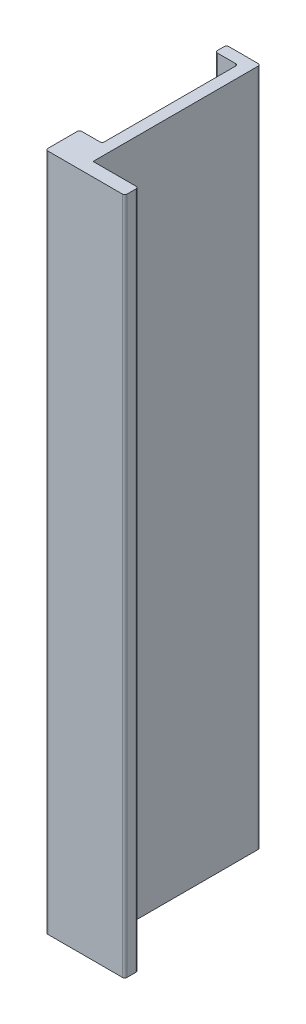
ISO-10303-21;
HEADER;
FILE_DESCRIPTION(('STEP AP214'),'2;1');
FILE_NAME('part.step','',(''),(''),'','','');
FILE_SCHEMA(('AUTOMOTIVE_DESIGN { 1 0 10303 214 1 1 1 1 }'));
ENDSEC;
DATA;
#1=APPLICATION_CONTEXT('core data for automotive mechanical design processes');
#2=APPLICATION_PROTOCOL_DEFINITION('international standard','automotive_design',2000,#1);
#3=PRODUCT_CONTEXT('',#1,'mechanical');
#4=PRODUCT('Part','Part','',(#3));
#5=PRODUCT_RELATED_PRODUCT_CATEGORY('part','',(#4));
#6=PRODUCT_DEFINITION_FORMATION('','',#4);
#7=PRODUCT_DEFINITION_CONTEXT('part definition',#1,'design');
#8=PRODUCT_DEFINITION('design','',#6,#7);
#9=PRODUCT_DEFINITION_SHAPE('','',#8);
#10=(LENGTH_UNIT() NAMED_UNIT(*) SI_UNIT(.MILLI.,.METRE.));
#11=(NAMED_UNIT(*) PLANE_ANGLE_UNIT() SI_UNIT($,.RADIAN.));
#12=(NAMED_UNIT(*) SI_UNIT($,.STERADIAN.) SOLID_ANGLE_UNIT());
#13=UNCERTAINTY_MEASURE_WITH_UNIT(LENGTH_MEASURE(1.E-05),#10,'distance_accuracy_value','');
#14=(GEOMETRIC_REPRESENTATION_CONTEXT(3) GLOBAL_UNCERTAINTY_ASSIGNED_CONTEXT((#13)) GLOBAL_UNIT_ASSIGNED_CONTEXT((#10,
#11,#12)) REPRESENTATION_CONTEXT('',''));
#15=CARTESIAN_POINT('',(0.,0.,0.));
#16=DIRECTION('',(0.,0.,1.));
#17=DIRECTION('',(1.,0.,0.));
#18=AXIS2_PLACEMENT_3D('',#15,#16,#17);
#19=CARTESIAN_POINT('',(0.,0.,0.));
#20=DIRECTION('',(1.,0.,0.));
#21=DIRECTION('',(0.,0.,-1.));
#22=AXIS2_PLACEMENT_3D('',#19,#20,#21);
#23=PLANE('',#22);
#24=DIRECTION('',(0.,0.,1.));
#25=VECTOR('',#24,1.);
#26=CARTESIAN_POINT('',(0.,300.,0.));
#27=LINE('',#26,#25);
#28=CARTESIAN_POINT('',(0.,300.,-14.));
#29=VERTEX_POINT('',#28);
#30=CARTESIAN_POINT('',(0.,300.,-1.));
#31=VERTEX_POINT('',#30);
#32=EDGE_CURVE('E216',#29,#31,#27,.T.);
#33=ORIENTED_EDGE('',*,*,#32,.F.);
#34=DIRECTION('',(0.,1.,0.));
#35=VECTOR('',#34,1.);
#36=CARTESIAN_POINT('',(0.,0.,-14.));
#37=LINE('',#36,#35);
#38=CARTESIAN_POINT('',(0.,0.,-14.));
#39=VERTEX_POINT('',#38);
#40=EDGE_CURVE('E247',#29,#39,#37,.F.);
#41=ORIENTED_EDGE('',*,*,#40,.T.);
#42=DIRECTION('',(0.,0.,-1.));
#43=VECTOR('',#42,1.);
#44=CARTESIAN_POINT('',(0.,0.,0.));
#45=LINE('',#44,#43);
#46=CARTESIAN_POINT('',(0.,0.,-1.));
#47=VERTEX_POINT('',#46);
#48=EDGE_CURVE('E213',#47,#39,#45,.T.);
#49=ORIENTED_EDGE('',*,*,#48,.F.);
#50=DIRECTION('',(0.,-1.,0.));
#51=VECTOR('',#50,1.);
#52=CARTESIAN_POINT('',(0.,0.,-1.));
#53=LINE('',#52,#51);
#54=EDGE_CURVE('E245',#47,#31,#53,.F.);
#55=ORIENTED_EDGE('',*,*,#54,.T.);
#56=EDGE_LOOP('',(#33,#41,#49,#55));
#57=FACE_BOUND('',#56,.T.);
#58=ADVANCED_FACE('F39',(#57),#23,.F.);
#59=CARTESIAN_POINT('',(15.,0.,0.));
#60=DIRECTION('',(0.,1.,0.));
#61=DIRECTION('',(0.,0.,1.));
#62=AXIS2_PLACEMENT_3D('',#59,#60,#61);
#63=PLANE('',#62);
#64=ORIENTED_EDGE('',*,*,#48,.T.);
#65=CARTESIAN_POINT('',(0.999999999999999,0.,-14.));
#66=DIRECTION('',(0.,1.,0.));
#67=DIRECTION('',(0.,0.,1.));
#68=AXIS2_PLACEMENT_3D('',#65,#66,#67);
#69=CIRCLE('',#68,1.);
#70=CARTESIAN_POINT('',(0.999999999999999,0.,-15.));
#71=VERTEX_POINT('',#70);
#72=EDGE_CURVE('E259',#39,#71,#69,.F.);
#73=ORIENTED_EDGE('',*,*,#72,.T.);
#74=DIRECTION('',(-1.,0.,0.));
#75=VECTOR('',#74,1.);
#76=CARTESIAN_POINT('',(10.,0.,-15.));
#77=LINE('',#76,#75);
#78=CARTESIAN_POINT('',(9.,0.,-15.));
#79=VERTEX_POINT('',#78);
#80=EDGE_CURVE('E203',#79,#71,#77,.T.);
#81=ORIENTED_EDGE('',*,*,#80,.F.);
#82=CARTESIAN_POINT('',(9.,0.,-16.));
#83=DIRECTION('',(0.,1.,0.));
#84=DIRECTION('',(0.,0.,1.));
#85=AXIS2_PLACEMENT_3D('',#82,#83,#84);
#86=CIRCLE('',#85,1.);
#87=CARTESIAN_POINT('',(10.,0.,-16.));
#88=VERTEX_POINT('',#87);
#89=EDGE_CURVE('E296',#79,#88,#86,.T.);
#90=ORIENTED_EDGE('',*,*,#89,.T.);
#91=DIRECTION('',(0.,0.,1.));
#92=VECTOR('',#91,1.);
#93=CARTESIAN_POINT('',(10.,0.,-15.));
#94=LINE('',#93,#92);
#95=CARTESIAN_POINT('',(10.,0.,-74.));
#96=VERTEX_POINT('',#95);
#97=EDGE_CURVE('E304',#96,#88,#94,.T.);
#98=ORIENTED_EDGE('',*,*,#97,.F.);
#99=CARTESIAN_POINT('',(9.,0.,-74.));
#100=DIRECTION('',(0.,1.,0.));
#101=DIRECTION('',(0.,0.,1.));
#102=AXIS2_PLACEMENT_3D('',#99,#100,#101);
#103=CIRCLE('',#102,1.);
#104=CARTESIAN_POINT('',(9.,0.,-75.));
#105=VERTEX_POINT('',#104);
#106=EDGE_CURVE('E47',#96,#105,#103,.T.);
#107=ORIENTED_EDGE('',*,*,#106,.T.);
#108=DIRECTION('',(-1.,0.,0.));
#109=VECTOR('',#108,1.);
#110=CARTESIAN_POINT('',(10.,0.,-75.));
#111=LINE('',#110,#109);
#112=CARTESIAN_POINT('',(0.999999999999999,0.,-75.));
#113=VERTEX_POINT('',#112);
#114=EDGE_CURVE('E302',#105,#113,#111,.T.);
#115=ORIENTED_EDGE('',*,*,#114,.T.);
#116=CARTESIAN_POINT('',(0.999999999999999,0.,-76.));
#117=DIRECTION('',(0.,1.,0.));
#118=DIRECTION('',(0.,0.,1.));
#119=AXIS2_PLACEMENT_3D('',#116,#117,#118);
#120=CIRCLE('',#119,1.);
#121=CARTESIAN_POINT('',(0.,0.,-76.));
#122=VERTEX_POINT('',#121);
#123=EDGE_CURVE('E249',#113,#122,#120,.F.);
#124=ORIENTED_EDGE('',*,*,#123,.T.);
#125=CARTESIAN_POINT('',(0.,0.,-79.));
#126=VERTEX_POINT('',#125);
#127=EDGE_CURVE('E208',#122,#126,#45,.T.);
#128=ORIENTED_EDGE('',*,*,#127,.T.);
#129=CARTESIAN_POINT('',(1.,0.,-79.));
#130=DIRECTION('',(0.,1.,0.));
#131=DIRECTION('',(0.,0.,1.));
#132=AXIS2_PLACEMENT_3D('',#129,#130,#131);
#133=CIRCLE('',#132,1.);
#134=CARTESIAN_POINT('',(1.,0.,-80.));
#135=VERTEX_POINT('',#134);
#136=EDGE_CURVE('E251',#126,#135,#133,.F.);
#137=ORIENTED_EDGE('',*,*,#136,.T.);
#138=DIRECTION('',(-1.,0.,0.));
#139=VECTOR('',#138,1.);
#140=CARTESIAN_POINT('',(15.,0.,-80.));
#141=LINE('',#140,#139);
#142=CARTESIAN_POINT('',(14.,0.,-80.));
#143=VERTEX_POINT('',#142);
#144=EDGE_CURVE('E224',#143,#135,#141,.T.);
#145=ORIENTED_EDGE('',*,*,#144,.F.);
#146=CARTESIAN_POINT('',(14.,0.,-79.));
#147=DIRECTION('',(0.,1.,0.));
#148=DIRECTION('',(0.,0.,1.));
#149=AXIS2_PLACEMENT_3D('',#146,#147,#148);
#150=CIRCLE('',#149,1.);
#151=CARTESIAN_POINT('',(15.,0.,-79.));
#152=VERTEX_POINT('',#151);
#153=EDGE_CURVE('E257',#143,#152,#150,.F.);
#154=ORIENTED_EDGE('',*,*,#153,.T.);
#155=DIRECTION('',(0.,0.,-1.));
#156=VECTOR('',#155,1.);
#157=CARTESIAN_POINT('',(15.,0.,0.));
#158=LINE('',#157,#156);
#159=CARTESIAN_POINT('',(15.,0.,-6.));
#160=VERTEX_POINT('',#159);
#161=EDGE_CURVE('E183',#160,#152,#158,.T.);
#162=ORIENTED_EDGE('',*,*,#161,.F.);
#163=DIRECTION('',(-1.,0.,0.));
#164=VECTOR('',#163,1.);
#165=CARTESIAN_POINT('',(35.,0.,-6.));
#166=LINE('',#165,#164);
#167=CARTESIAN_POINT('',(34.,0.,-6.));
#168=VERTEX_POINT('',#167);
#169=EDGE_CURVE('E193',#168,#160,#166,.T.);
#170=ORIENTED_EDGE('',*,*,#169,.F.);
#171=CARTESIAN_POINT('',(34.,0.,-5.));
#172=DIRECTION('',(0.,1.,0.));
#173=DIRECTION('',(0.,0.,1.));
#174=AXIS2_PLACEMENT_3D('',#171,#172,#173);
#175=CIRCLE('',#174,1.);
#176=CARTESIAN_POINT('',(35.,0.,-5.));
#177=VERTEX_POINT('',#176);
#178=EDGE_CURVE('E254',#168,#177,#175,.F.);
#179=ORIENTED_EDGE('',*,*,#178,.T.);
#180=DIRECTION('',(0.,0.,-1.));
#181=VECTOR('',#180,1.);
#182=CARTESIAN_POINT('',(35.,0.,0.));
#183=LINE('',#182,#181);
#184=CARTESIAN_POINT('',(35.,0.,-1.));
#185=VERTEX_POINT('',#184);
#186=EDGE_CURVE('E198',#185,#177,#183,.T.);
#187=ORIENTED_EDGE('',*,*,#186,.F.);
#188=CARTESIAN_POINT('',(34.,0.,-1.));
#189=DIRECTION('',(0.,1.,0.));
#190=DIRECTION('',(0.,0.,1.));
#191=AXIS2_PLACEMENT_3D('',#188,#189,#190);
#192=CIRCLE('',#191,1.);
#193=CARTESIAN_POINT('',(34.,0.,0.));
#194=VERTEX_POINT('',#193);
#195=EDGE_CURVE('E62',#185,#194,#192,.F.);
#196=ORIENTED_EDGE('',*,*,#195,.T.);
#197=DIRECTION('',(-1.,0.,0.));
#198=VECTOR('',#197,1.);
#199=CARTESIAN_POINT('',(15.,0.,0.));
#200=LINE('',#199,#198);
#201=CARTESIAN_POINT('',(1.,0.,0.));
#202=VERTEX_POINT('',#201);
#203=EDGE_CURVE('E182',#194,#202,#200,.T.);
#204=ORIENTED_EDGE('',*,*,#203,.T.);
#205=CARTESIAN_POINT('',(1.,0.,-1.));
#206=DIRECTION('',(0.,1.,0.));
#207=DIRECTION('',(0.,0.,1.));
#208=AXIS2_PLACEMENT_3D('',#205,#206,#207);
#209=CIRCLE('',#208,1.);
#210=EDGE_CURVE('E54',#202,#47,#209,.F.);
#211=ORIENTED_EDGE('',*,*,#210,.T.);
#212=EDGE_LOOP('',(#64,#73,#81,#90,#98,#107,#115,#124,#128,#137,#145,#154,#162,#170,#179,#187,
#196,#204,#211));
#213=FACE_BOUND('',#212,.T.);
#214=ADVANCED_FACE('F301',(#213),#63,.F.);
#215=CARTESIAN_POINT('',(15.,0.,-80.));
#216=DIRECTION('',(0.,0.,1.));
#217=DIRECTION('',(1.,0.,0.));
#218=AXIS2_PLACEMENT_3D('',#215,#216,#217);
#219=PLANE('',#218);
#220=DIRECTION('',(-1.,0.,0.));
#221=VECTOR('',#220,1.);
#222=CARTESIAN_POINT('',(15.,300.,-80.));
#223=LINE('',#222,#221);
#224=CARTESIAN_POINT('',(14.,300.,-80.));
#225=VERTEX_POINT('',#224);
#226=CARTESIAN_POINT('',(1.,300.,-80.));
#227=VERTEX_POINT('',#226);
#228=EDGE_CURVE('E221',#225,#227,#223,.T.);
#229=ORIENTED_EDGE('',*,*,#228,.F.);
#230=DIRECTION('',(0.,1.,0.));
#231=VECTOR('',#230,1.);
#232=CARTESIAN_POINT('',(14.,0.,-80.));
#233=LINE('',#232,#231);
#234=EDGE_CURVE('E265',#225,#143,#233,.F.);
#235=ORIENTED_EDGE('',*,*,#234,.T.);
#236=ORIENTED_EDGE('',*,*,#144,.T.);
#237=DIRECTION('',(0.,1.,0.));
#238=VECTOR('',#237,1.);
#239=CARTESIAN_POINT('',(1.,0.,-80.));
#240=LINE('',#239,#238);
#241=EDGE_CURVE('E262',#135,#227,#240,.T.);
#242=ORIENTED_EDGE('',*,*,#241,.T.);
#243=EDGE_LOOP('',(#229,#235,#236,#242));
#244=FACE_BOUND('',#243,.T.);
#245=ADVANCED_FACE('F344',(#244),#219,.F.);
#246=CARTESIAN_POINT('',(15.,300.,0.));
#247=DIRECTION('',(0.,-1.,0.));
#248=DIRECTION('',(0.,0.,-1.));
#249=AXIS2_PLACEMENT_3D('',#246,#247,#248);
#250=PLANE('',#249);
#251=DIRECTION('',(-1.,0.,0.));
#252=VECTOR('',#251,1.);
#253=CARTESIAN_POINT('',(10.,300.,-15.));
#254=LINE('',#253,#252);
#255=CARTESIAN_POINT('',(9.,300.,-15.));
#256=VERTEX_POINT('',#255);
#257=CARTESIAN_POINT('',(0.999999999999999,300.,-15.));
#258=VERTEX_POINT('',#257);
#259=EDGE_CURVE('E199',#256,#258,#254,.T.);
#260=ORIENTED_EDGE('',*,*,#259,.T.);
#261=CARTESIAN_POINT('',(0.999999999999999,300.,-14.));
#262=DIRECTION('',(0.,-1.,0.));
#263=DIRECTION('',(0.,0.,-1.));
#264=AXIS2_PLACEMENT_3D('',#261,#262,#263);
#265=CIRCLE('',#264,1.);
#266=EDGE_CURVE('E243',#258,#29,#265,.F.);
#267=ORIENTED_EDGE('',*,*,#266,.T.);
#268=ORIENTED_EDGE('',*,*,#32,.T.);
#269=CARTESIAN_POINT('',(1.,300.,-1.));
#270=DIRECTION('',(0.,-1.,0.));
#271=DIRECTION('',(0.,0.,-1.));
#272=AXIS2_PLACEMENT_3D('',#269,#270,#271);
#273=CIRCLE('',#272,1.);
#274=CARTESIAN_POINT('',(1.,300.,0.));
#275=VERTEX_POINT('',#274);
#276=EDGE_CURVE('E236',#31,#275,#273,.F.);
#277=ORIENTED_EDGE('',*,*,#276,.T.);
#278=DIRECTION('',(-1.,0.,0.));
#279=VECTOR('',#278,1.);
#280=CARTESIAN_POINT('',(15.,300.,0.));
#281=LINE('',#280,#279);
#282=CARTESIAN_POINT('',(34.,300.,0.));
#283=VERTEX_POINT('',#282);
#284=EDGE_CURVE('E218',#283,#275,#281,.T.);
#285=ORIENTED_EDGE('',*,*,#284,.F.);
#286=CARTESIAN_POINT('',(34.,300.,-1.));
#287=DIRECTION('',(0.,-1.,0.));
#288=DIRECTION('',(0.,0.,-1.));
#289=AXIS2_PLACEMENT_3D('',#286,#287,#288);
#290=CIRCLE('',#289,1.);
#291=CARTESIAN_POINT('',(35.,300.,-1.));
#292=VERTEX_POINT('',#291);
#293=EDGE_CURVE('E239',#283,#292,#290,.F.);
#294=ORIENTED_EDGE('',*,*,#293,.T.);
#295=DIRECTION('',(0.,0.,1.));
#296=VECTOR('',#295,1.);
#297=CARTESIAN_POINT('',(35.,300.,0.));
#298=LINE('',#297,#296);
#299=CARTESIAN_POINT('',(35.,300.,-5.00000000000001));
#300=VERTEX_POINT('',#299);
#301=EDGE_CURVE('E194',#300,#292,#298,.T.);
#302=ORIENTED_EDGE('',*,*,#301,.F.);
#303=CARTESIAN_POINT('',(34.,300.,-5.00000000000001));
#304=DIRECTION('',(0.,-1.,0.));
#305=DIRECTION('',(0.,0.,-1.));
#306=AXIS2_PLACEMENT_3D('',#303,#304,#305);
#307=CIRCLE('',#306,1.);
#308=CARTESIAN_POINT('',(34.,300.,-6.00000000000001));
#309=VERTEX_POINT('',#308);
#310=EDGE_CURVE('E190',#300,#309,#307,.F.);
#311=ORIENTED_EDGE('',*,*,#310,.T.);
#312=DIRECTION('',(-1.,0.,0.));
#313=VECTOR('',#312,1.);
#314=CARTESIAN_POINT('',(35.,300.,-6.00000000000001));
#315=LINE('',#314,#313);
#316=CARTESIAN_POINT('',(15.,300.,-6.00000000000001));
#317=VERTEX_POINT('',#316);
#318=EDGE_CURVE('E186',#309,#317,#315,.T.);
#319=ORIENTED_EDGE('',*,*,#318,.T.);
#320=DIRECTION('',(0.,0.,1.));
#321=VECTOR('',#320,1.);
#322=CARTESIAN_POINT('',(15.,300.,0.));
#323=LINE('',#322,#321);
#324=CARTESIAN_POINT('',(15.,300.,-79.));
#325=VERTEX_POINT('',#324);
#326=EDGE_CURVE('E172',#325,#317,#323,.T.);
#327=ORIENTED_EDGE('',*,*,#326,.F.);
#328=CARTESIAN_POINT('',(14.,300.,-79.));
#329=DIRECTION('',(0.,-1.,0.));
#330=DIRECTION('',(0.,0.,-1.));
#331=AXIS2_PLACEMENT_3D('',#328,#329,#330);
#332=CIRCLE('',#331,1.);
#333=EDGE_CURVE('E241',#325,#225,#332,.F.);
#334=ORIENTED_EDGE('',*,*,#333,.T.);
#335=ORIENTED_EDGE('',*,*,#228,.T.);
#336=CARTESIAN_POINT('',(1.,300.,-79.));
#337=DIRECTION('',(0.,-1.,0.));
#338=DIRECTION('',(0.,0.,-1.));
#339=AXIS2_PLACEMENT_3D('',#336,#337,#338);
#340=CIRCLE('',#339,1.);
#341=CARTESIAN_POINT('',(0.,300.,-79.));
#342=VERTEX_POINT('',#341);
#343=EDGE_CURVE('E234',#227,#342,#340,.F.);
#344=ORIENTED_EDGE('',*,*,#343,.T.);
#345=CARTESIAN_POINT('',(0.,300.,-76.));
#346=VERTEX_POINT('',#345);
#347=EDGE_CURVE('E209',#342,#346,#27,.T.);
#348=ORIENTED_EDGE('',*,*,#347,.T.);
#349=CARTESIAN_POINT('',(0.999999999999999,300.,-76.));
#350=DIRECTION('',(0.,-1.,0.));
#351=DIRECTION('',(0.,0.,-1.));
#352=AXIS2_PLACEMENT_3D('',#349,#350,#351);
#353=CIRCLE('',#352,1.);
#354=CARTESIAN_POINT('',(0.999999999999999,300.,-75.));
#355=VERTEX_POINT('',#354);
#356=EDGE_CURVE('E232',#346,#355,#353,.F.);
#357=ORIENTED_EDGE('',*,*,#356,.T.);
#358=DIRECTION('',(-1.,0.,0.));
#359=VECTOR('',#358,1.);
#360=CARTESIAN_POINT('',(10.,300.,-75.));
#361=LINE('',#360,#359);
#362=CARTESIAN_POINT('',(9.,300.,-75.));
#363=VERTEX_POINT('',#362);
#364=EDGE_CURVE('E313',#363,#355,#361,.T.);
#365=ORIENTED_EDGE('',*,*,#364,.F.);
#366=CARTESIAN_POINT('',(9.,300.,-74.));
#367=DIRECTION('',(0.,-1.,0.));
#368=DIRECTION('',(0.,0.,-1.));
#369=AXIS2_PLACEMENT_3D('',#366,#367,#368);
#370=CIRCLE('',#369,1.);
#371=CARTESIAN_POINT('',(10.,300.,-74.));
#372=VERTEX_POINT('',#371);
#373=EDGE_CURVE('E11',#363,#372,#370,.T.);
#374=ORIENTED_EDGE('',*,*,#373,.T.);
#375=DIRECTION('',(0.,0.,-1.));
#376=VECTOR('',#375,1.);
#377=CARTESIAN_POINT('',(10.,300.,-15.));
#378=LINE('',#377,#376);
#379=CARTESIAN_POINT('',(10.,300.,-16.));
#380=VERTEX_POINT('',#379);
#381=EDGE_CURVE('E318',#380,#372,#378,.T.);
#382=ORIENTED_EDGE('',*,*,#381,.F.);
#383=CARTESIAN_POINT('',(9.,300.,-16.));
#384=DIRECTION('',(0.,-1.,0.));
#385=DIRECTION('',(0.,0.,-1.));
#386=AXIS2_PLACEMENT_3D('',#383,#384,#385);
#387=CIRCLE('',#386,1.);
#388=EDGE_CURVE('E294',#380,#256,#387,.T.);
#389=ORIENTED_EDGE('',*,*,#388,.T.);
#390=EDGE_LOOP('',(#260,#267,#268,#277,#285,#294,#302,#311,#319,#327,#334,#335,#344,#348,#357,
#365,#374,#382,#389));
#391=FACE_BOUND('',#390,.T.);
#392=ADVANCED_FACE('F188',(#391),#250,.F.);
#393=CARTESIAN_POINT('',(15.,0.,0.));
#394=DIRECTION('',(0.,0.,-1.));
#395=DIRECTION('',(-1.,0.,0.));
#396=AXIS2_PLACEMENT_3D('',#393,#394,#395);
#397=PLANE('',#396);
#398=ORIENTED_EDGE('',*,*,#203,.F.);
#399=DIRECTION('',(0.,-1.,0.));
#400=VECTOR('',#399,1.);
#401=CARTESIAN_POINT('',(34.,300.,0.));
#402=LINE('',#401,#400);
#403=EDGE_CURVE('E275',#194,#283,#402,.F.);
#404=ORIENTED_EDGE('',*,*,#403,.T.);
#405=ORIENTED_EDGE('',*,*,#284,.T.);
#406=DIRECTION('',(0.,-1.,0.));
#407=VECTOR('',#406,1.);
#408=CARTESIAN_POINT('',(1.,0.,0.));
#409=LINE('',#408,#407);
#410=EDGE_CURVE('E273',#275,#202,#409,.T.);
#411=ORIENTED_EDGE('',*,*,#410,.T.);
#412=EDGE_LOOP('',(#398,#404,#405,#411));
#413=FACE_BOUND('',#412,.T.);
#414=ADVANCED_FACE('F362',(#413),#397,.F.);
#415=CARTESIAN_POINT('',(15.,0.,0.));
#416=DIRECTION('',(1.,0.,0.));
#417=DIRECTION('',(0.,0.,-1.));
#418=AXIS2_PLACEMENT_3D('',#415,#416,#417);
#419=PLANE('',#418);
#420=ORIENTED_EDGE('',*,*,#161,.T.);
#421=DIRECTION('',(0.,1.,0.));
#422=VECTOR('',#421,1.);
#423=CARTESIAN_POINT('',(15.,300.,-79.));
#424=LINE('',#423,#422);
#425=EDGE_CURVE('E180',#152,#325,#424,.T.);
#426=ORIENTED_EDGE('',*,*,#425,.T.);
#427=ORIENTED_EDGE('',*,*,#326,.T.);
#428=DIRECTION('',(0.,1.,0.));
#429=VECTOR('',#428,1.);
#430=CARTESIAN_POINT('',(15.,0.,-6.));
#431=LINE('',#430,#429);
#432=EDGE_CURVE('E177',#160,#317,#431,.T.);
#433=ORIENTED_EDGE('',*,*,#432,.F.);
#434=EDGE_LOOP('',(#420,#426,#427,#433));
#435=FACE_BOUND('',#434,.T.);
#436=ADVANCED_FACE('F175',(#435),#419,.T.);
#437=ORIENTED_EDGE('',*,*,#347,.F.);
#438=DIRECTION('',(0.,1.,0.));
#439=VECTOR('',#438,1.);
#440=CARTESIAN_POINT('',(0.,0.,-79.));
#441=LINE('',#440,#439);
#442=EDGE_CURVE('E287',#342,#126,#441,.F.);
#443=ORIENTED_EDGE('',*,*,#442,.T.);
#444=ORIENTED_EDGE('',*,*,#127,.F.);
#445=DIRECTION('',(0.,-1.,0.));
#446=VECTOR('',#445,1.);
#447=CARTESIAN_POINT('',(0.,0.,-76.));
#448=LINE('',#447,#446);
#449=EDGE_CURVE('E285',#122,#346,#448,.F.);
#450=ORIENTED_EDGE('',*,*,#449,.T.);
#451=EDGE_LOOP('',(#437,#443,#444,#450));
#452=FACE_BOUND('',#451,.T.);
#453=ADVANCED_FACE('F335',(#452),#23,.F.);
#454=CARTESIAN_POINT('',(35.,0.,-6.));
#455=DIRECTION('',(0.,0.,1.));
#456=DIRECTION('',(0.,-1.,0.));
#457=AXIS2_PLACEMENT_3D('',#454,#455,#456);
#458=PLANE('',#457);
#459=ORIENTED_EDGE('',*,*,#318,.F.);
#460=DIRECTION('',(0.,1.,0.));
#461=VECTOR('',#460,1.);
#462=CARTESIAN_POINT('',(34.,0.,-6.));
#463=LINE('',#462,#461);
#464=EDGE_CURVE('E277',#309,#168,#463,.F.);
#465=ORIENTED_EDGE('',*,*,#464,.T.);
#466=ORIENTED_EDGE('',*,*,#169,.T.);
#467=ORIENTED_EDGE('',*,*,#432,.T.);
#468=EDGE_LOOP('',(#459,#465,#466,#467));
#469=FACE_BOUND('',#468,.T.);
#470=ADVANCED_FACE('F196',(#469),#458,.F.);
#471=CARTESIAN_POINT('',(35.,0.,0.));
#472=DIRECTION('',(1.,0.,0.));
#473=DIRECTION('',(0.,0.,-1.));
#474=AXIS2_PLACEMENT_3D('',#471,#472,#473);
#475=PLANE('',#474);
#476=ORIENTED_EDGE('',*,*,#301,.T.);
#477=DIRECTION('',(0.,-1.,0.));
#478=VECTOR('',#477,1.);
#479=CARTESIAN_POINT('',(35.,0.,-1.));
#480=LINE('',#479,#478);
#481=EDGE_CURVE('E270',#292,#185,#480,.T.);
#482=ORIENTED_EDGE('',*,*,#481,.T.);
#483=ORIENTED_EDGE('',*,*,#186,.T.);
#484=DIRECTION('',(0.,1.,0.));
#485=VECTOR('',#484,1.);
#486=CARTESIAN_POINT('',(35.,300.,-5.00000000000001));
#487=LINE('',#486,#485);
#488=EDGE_CURVE('E267',#177,#300,#487,.T.);
#489=ORIENTED_EDGE('',*,*,#488,.T.);
#490=EDGE_LOOP('',(#476,#482,#483,#489));
#491=FACE_BOUND('',#490,.T.);
#492=ADVANCED_FACE('F354',(#491),#475,.T.);
#493=CARTESIAN_POINT('',(10.,300.,-15.));
#494=DIRECTION('',(0.,0.,1.));
#495=DIRECTION('',(1.,0.,0.));
#496=AXIS2_PLACEMENT_3D('',#493,#494,#495);
#497=PLANE('',#496);
#498=ORIENTED_EDGE('',*,*,#80,.T.);
#499=DIRECTION('',(0.,1.,0.));
#500=VECTOR('',#499,1.);
#501=CARTESIAN_POINT('',(0.999999999999999,300.,-15.));
#502=LINE('',#501,#500);
#503=EDGE_CURVE('E229',#71,#258,#502,.T.);
#504=ORIENTED_EDGE('',*,*,#503,.T.);
#505=ORIENTED_EDGE('',*,*,#259,.F.);
#506=DIRECTION('',(0.,1.,0.));
#507=VECTOR('',#506,1.);
#508=CARTESIAN_POINT('',(9.,300.,-15.));
#509=LINE('',#508,#507);
#510=EDGE_CURVE('E227',#256,#79,#509,.F.);
#511=ORIENTED_EDGE('',*,*,#510,.T.);
#512=EDGE_LOOP('',(#498,#504,#505,#511));
#513=FACE_BOUND('',#512,.T.);
#514=ADVANCED_FACE('F377',(#513),#497,.F.);
#515=CARTESIAN_POINT('',(10.,300.,-75.));
#516=DIRECTION('',(0.,0.,-1.));
#517=DIRECTION('',(-1.,0.,0.));
#518=AXIS2_PLACEMENT_3D('',#515,#516,#517);
#519=PLANE('',#518);
#520=ORIENTED_EDGE('',*,*,#364,.T.);
#521=DIRECTION('',(0.,-1.,0.));
#522=VECTOR('',#521,1.);
#523=CARTESIAN_POINT('',(0.999999999999999,300.,-75.));
#524=LINE('',#523,#522);
#525=EDGE_CURVE('E291',#355,#113,#524,.T.);
#526=ORIENTED_EDGE('',*,*,#525,.T.);
#527=ORIENTED_EDGE('',*,*,#114,.F.);
#528=DIRECTION('',(0.,-1.,0.));
#529=VECTOR('',#528,1.);
#530=CARTESIAN_POINT('',(9.,300.,-75.));
#531=LINE('',#530,#529);
#532=EDGE_CURVE('E289',#105,#363,#531,.F.);
#533=ORIENTED_EDGE('',*,*,#532,.T.);
#534=EDGE_LOOP('',(#520,#526,#527,#533));
#535=FACE_BOUND('',#534,.T.);
#536=ADVANCED_FACE('F310',(#535),#519,.F.);
#537=CARTESIAN_POINT('',(10.,0.,0.));
#538=DIRECTION('',(-1.,0.,0.));
#539=DIRECTION('',(0.,0.,1.));
#540=AXIS2_PLACEMENT_3D('',#537,#538,#539);
#541=PLANE('',#540);
#542=ORIENTED_EDGE('',*,*,#97,.T.);
#543=DIRECTION('',(0.,1.,0.));
#544=VECTOR('',#543,1.);
#545=CARTESIAN_POINT('',(10.,0.,-16.));
#546=LINE('',#545,#544);
#547=EDGE_CURVE('E282',#88,#380,#546,.T.);
#548=ORIENTED_EDGE('',*,*,#547,.T.);
#549=ORIENTED_EDGE('',*,*,#381,.T.);
#550=DIRECTION('',(0.,-1.,0.));
#551=VECTOR('',#550,1.);
#552=CARTESIAN_POINT('',(10.,0.,-74.));
#553=LINE('',#552,#551);
#554=EDGE_CURVE('E279',#372,#96,#553,.T.);
#555=ORIENTED_EDGE('',*,*,#554,.T.);
#556=EDGE_LOOP('',(#542,#548,#549,#555));
#557=FACE_BOUND('',#556,.T.);
#558=ADVANCED_FACE('F320',(#557),#541,.T.);
#559=CARTESIAN_POINT('',(0.999999999999999,300.,-14.));
#560=DIRECTION('',(0.,1.,0.));
#561=DIRECTION('',(0.,0.,1.));
#562=AXIS2_PLACEMENT_3D('',#559,#560,#561);
#563=CYLINDRICAL_SURFACE('',#562,1.);
#564=ORIENTED_EDGE('',*,*,#72,.F.);
#565=ORIENTED_EDGE('',*,*,#40,.F.);
#566=ORIENTED_EDGE('',*,*,#266,.F.);
#567=ORIENTED_EDGE('',*,*,#503,.F.);
#568=EDGE_LOOP('',(#564,#565,#566,#567));
#569=FACE_BOUND('',#568,.T.);
#570=ADVANCED_FACE('F372',(#569),#563,.T.);
#571=CARTESIAN_POINT('',(14.,0.,-79.));
#572=DIRECTION('',(0.,-1.,0.));
#573=DIRECTION('',(0.,0.,-1.));
#574=AXIS2_PLACEMENT_3D('',#571,#572,#573);
#575=CYLINDRICAL_SURFACE('',#574,1.);
#576=ORIENTED_EDGE('',*,*,#153,.F.);
#577=ORIENTED_EDGE('',*,*,#234,.F.);
#578=ORIENTED_EDGE('',*,*,#333,.F.);
#579=ORIENTED_EDGE('',*,*,#425,.F.);
#580=EDGE_LOOP('',(#576,#577,#578,#579));
#581=FACE_BOUND('',#580,.T.);
#582=ADVANCED_FACE('F347',(#581),#575,.T.);
#583=CARTESIAN_POINT('',(34.,0.,-1.));
#584=DIRECTION('',(0.,1.,0.));
#585=DIRECTION('',(0.,0.,1.));
#586=AXIS2_PLACEMENT_3D('',#583,#584,#585);
#587=CYLINDRICAL_SURFACE('',#586,1.);
#588=ORIENTED_EDGE('',*,*,#293,.F.);
#589=ORIENTED_EDGE('',*,*,#403,.F.);
#590=ORIENTED_EDGE('',*,*,#195,.F.);
#591=ORIENTED_EDGE('',*,*,#481,.F.);
#592=EDGE_LOOP('',(#588,#589,#590,#591));
#593=FACE_BOUND('',#592,.T.);
#594=ADVANCED_FACE('F360',(#593),#587,.T.);
#595=CARTESIAN_POINT('',(34.,0.,-5.));
#596=DIRECTION('',(0.,-1.,0.));
#597=DIRECTION('',(0.,0.,-1.));
#598=AXIS2_PLACEMENT_3D('',#595,#596,#597);
#599=CYLINDRICAL_SURFACE('',#598,1.);
#600=ORIENTED_EDGE('',*,*,#178,.F.);
#601=ORIENTED_EDGE('',*,*,#464,.F.);
#602=ORIENTED_EDGE('',*,*,#310,.F.);
#603=ORIENTED_EDGE('',*,*,#488,.F.);
#604=EDGE_LOOP('',(#600,#601,#602,#603));
#605=FACE_BOUND('',#604,.T.);
#606=ADVANCED_FACE('F351',(#605),#599,.T.);
#607=CARTESIAN_POINT('',(1.,0.,-1.));
#608=DIRECTION('',(0.,-1.,0.));
#609=DIRECTION('',(0.,0.,-1.));
#610=AXIS2_PLACEMENT_3D('',#607,#608,#609);
#611=CYLINDRICAL_SURFACE('',#610,1.);
#612=ORIENTED_EDGE('',*,*,#276,.F.);
#613=ORIENTED_EDGE('',*,*,#54,.F.);
#614=ORIENTED_EDGE('',*,*,#210,.F.);
#615=ORIENTED_EDGE('',*,*,#410,.F.);
#616=EDGE_LOOP('',(#612,#613,#614,#615));
#617=FACE_BOUND('',#616,.T.);
#618=ADVANCED_FACE('F370',(#617),#611,.T.);
#619=CARTESIAN_POINT('',(9.,0.,-16.));
#620=DIRECTION('',(0.,1.,0.));
#621=DIRECTION('',(0.,0.,1.));
#622=AXIS2_PLACEMENT_3D('',#619,#620,#621);
#623=CYLINDRICAL_SURFACE('',#622,1.);
#624=ORIENTED_EDGE('',*,*,#89,.F.);
#625=ORIENTED_EDGE('',*,*,#510,.F.);
#626=ORIENTED_EDGE('',*,*,#388,.F.);
#627=ORIENTED_EDGE('',*,*,#547,.F.);
#628=EDGE_LOOP('',(#624,#625,#626,#627));
#629=FACE_BOUND('',#628,.T.);
#630=ADVANCED_FACE('F381',(#629),#623,.F.);
#631=CARTESIAN_POINT('',(1.,0.,-79.));
#632=DIRECTION('',(0.,1.,0.));
#633=DIRECTION('',(0.,0.,1.));
#634=AXIS2_PLACEMENT_3D('',#631,#632,#633);
#635=CYLINDRICAL_SURFACE('',#634,1.);
#636=ORIENTED_EDGE('',*,*,#136,.F.);
#637=ORIENTED_EDGE('',*,*,#442,.F.);
#638=ORIENTED_EDGE('',*,*,#343,.F.);
#639=ORIENTED_EDGE('',*,*,#241,.F.);
#640=EDGE_LOOP('',(#636,#637,#638,#639));
#641=FACE_BOUND('',#640,.T.);
#642=ADVANCED_FACE('F338',(#641),#635,.T.);
#643=CARTESIAN_POINT('',(0.999999999999999,300.,-76.));
#644=DIRECTION('',(0.,-1.,0.));
#645=DIRECTION('',(0.,0.,-1.));
#646=AXIS2_PLACEMENT_3D('',#643,#644,#645);
#647=CYLINDRICAL_SURFACE('',#646,1.);
#648=ORIENTED_EDGE('',*,*,#356,.F.);
#649=ORIENTED_EDGE('',*,*,#449,.F.);
#650=ORIENTED_EDGE('',*,*,#123,.F.);
#651=ORIENTED_EDGE('',*,*,#525,.F.);
#652=EDGE_LOOP('',(#648,#649,#650,#651));
#653=FACE_BOUND('',#652,.T.);
#654=ADVANCED_FACE('F329',(#653),#647,.T.);
#655=CARTESIAN_POINT('',(9.,0.,-74.));
#656=DIRECTION('',(0.,-1.,0.));
#657=DIRECTION('',(0.,0.,-1.));
#658=AXIS2_PLACEMENT_3D('',#655,#656,#657);
#659=CYLINDRICAL_SURFACE('',#658,1.);
#660=ORIENTED_EDGE('',*,*,#373,.F.);
#661=ORIENTED_EDGE('',*,*,#532,.F.);
#662=ORIENTED_EDGE('',*,*,#106,.F.);
#663=ORIENTED_EDGE('',*,*,#554,.F.);
#664=EDGE_LOOP('',(#660,#661,#662,#663));
#665=FACE_BOUND('',#664,.T.);
#666=ADVANCED_FACE('F41',(#665),#659,.F.);
#667=CLOSED_SHELL('',(#58,#214,#245,#392,#414,#436,#453,#470,#492,#514,#536,#558,#570,#582,#594,
#606,#618,#630,#642,#654,#666));
#668=MANIFOLD_SOLID_BREP('B2',#667);
#669=ADVANCED_BREP_SHAPE_REPRESENTATION('',(#18,#668),#14);
#670=SHAPE_DEFINITION_REPRESENTATION(#9,#669);
ENDSEC;
END-ISO-10303-21;
